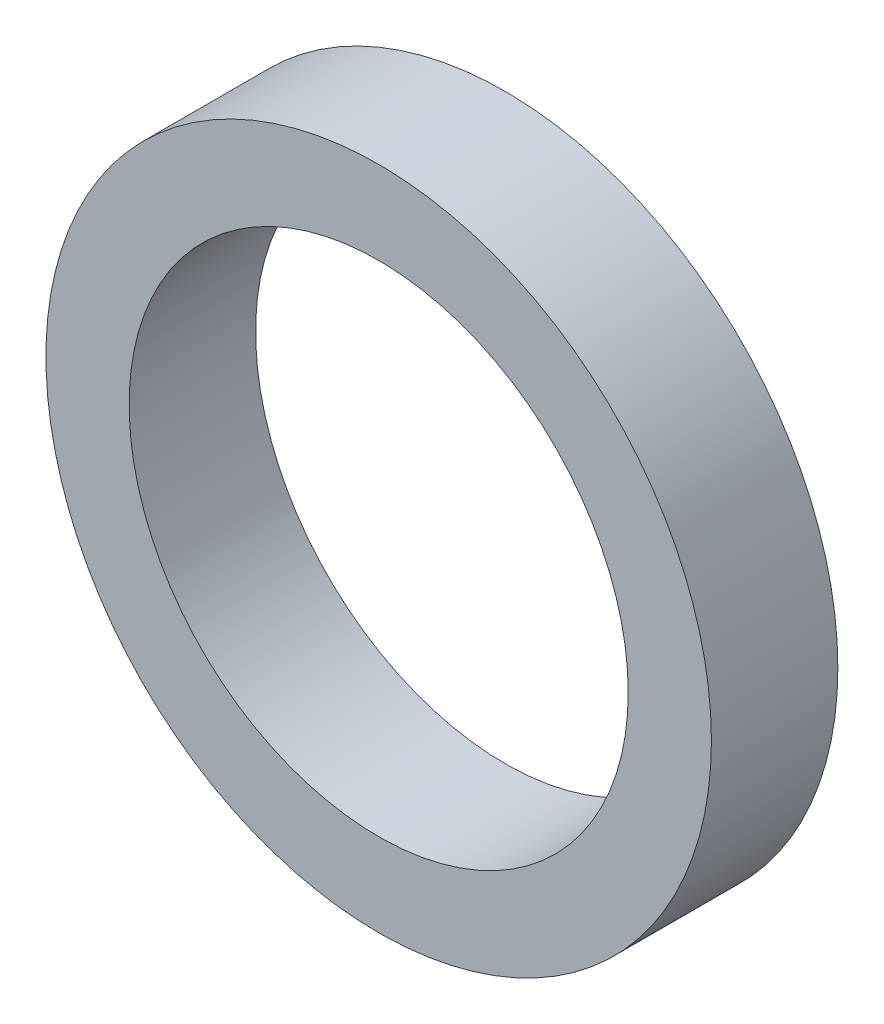
ISO-10303-21;
HEADER;
FILE_DESCRIPTION(('STEP AP214'),'2;1');
FILE_NAME('part.step','',(''),(''),'','','');
FILE_SCHEMA(('AUTOMOTIVE_DESIGN { 1 0 10303 214 1 1 1 1 }'));
ENDSEC;
DATA;
#1=APPLICATION_CONTEXT('core data for automotive mechanical design processes');
#2=APPLICATION_PROTOCOL_DEFINITION('international standard','automotive_design',2000,#1);
#3=PRODUCT_CONTEXT('',#1,'mechanical');
#4=PRODUCT('Part','Part','',(#3));
#5=PRODUCT_RELATED_PRODUCT_CATEGORY('part','',(#4));
#6=PRODUCT_DEFINITION_FORMATION('','',#4);
#7=PRODUCT_DEFINITION_CONTEXT('part definition',#1,'design');
#8=PRODUCT_DEFINITION('design','',#6,#7);
#9=PRODUCT_DEFINITION_SHAPE('','',#8);
#10=(LENGTH_UNIT() NAMED_UNIT(*) SI_UNIT(.MILLI.,.METRE.));
#11=(NAMED_UNIT(*) PLANE_ANGLE_UNIT() SI_UNIT($,.RADIAN.));
#12=(NAMED_UNIT(*) SI_UNIT($,.STERADIAN.) SOLID_ANGLE_UNIT());
#13=UNCERTAINTY_MEASURE_WITH_UNIT(LENGTH_MEASURE(1.E-05),#10,'distance_accuracy_value','');
#14=(GEOMETRIC_REPRESENTATION_CONTEXT(3) GLOBAL_UNCERTAINTY_ASSIGNED_CONTEXT((#13)) GLOBAL_UNIT_ASSIGNED_CONTEXT((#10,
#11,#12)) REPRESENTATION_CONTEXT('',''));
#15=CARTESIAN_POINT('',(0.,0.,0.));
#16=DIRECTION('',(0.,0.,1.));
#17=DIRECTION('',(1.,0.,0.));
#18=AXIS2_PLACEMENT_3D('',#15,#16,#17);
#19=CARTESIAN_POINT('',(0.,0.,19.));
#20=DIRECTION('',(0.,0.,1.));
#21=DIRECTION('',(1.,0.,0.));
#22=AXIS2_PLACEMENT_3D('',#19,#20,#21);
#23=PLANE('',#22);
#24=CARTESIAN_POINT('',(0.,0.,19.));
#25=DIRECTION('',(0.,0.,1.));
#26=DIRECTION('',(1.,0.,0.));
#27=AXIS2_PLACEMENT_3D('',#24,#25,#26);
#28=CIRCLE('',#27,50.);
#29=CARTESIAN_POINT('',(50.,0.,19.));
#30=VERTEX_POINT('',#29);
#31=EDGE_CURVE('E10',#30,#30,#28,.T.);
#32=ORIENTED_EDGE('',*,*,#31,.T.);
#33=EDGE_LOOP('',(#32));
#34=FACE_BOUND('',#33,.T.);
#35=CARTESIAN_POINT('',(0.,0.,19.));
#36=DIRECTION('',(0.,0.,1.));
#37=DIRECTION('',(1.,0.,0.));
#38=AXIS2_PLACEMENT_3D('',#35,#36,#37);
#39=CIRCLE('',#38,37.5);
#40=CARTESIAN_POINT('',(37.5,0.,19.));
#41=VERTEX_POINT('',#40);
#42=EDGE_CURVE('E49',#41,#41,#39,.T.);
#43=ORIENTED_EDGE('',*,*,#42,.F.);
#44=EDGE_LOOP('',(#43));
#45=FACE_BOUND('',#44,.T.);
#46=ADVANCED_FACE('F34',(#34,#45),#23,.T.);
#47=CARTESIAN_POINT('',(0.,0.,0.));
#48=DIRECTION('',(0.,0.,1.));
#49=DIRECTION('',(1.,0.,0.));
#50=AXIS2_PLACEMENT_3D('',#47,#48,#49);
#51=PLANE('',#50);
#52=CARTESIAN_POINT('',(0.,0.,0.));
#53=DIRECTION('',(0.,0.,1.));
#54=DIRECTION('',(1.,0.,0.));
#55=AXIS2_PLACEMENT_3D('',#52,#53,#54);
#56=CIRCLE('',#55,50.);
#57=CARTESIAN_POINT('',(50.,0.,0.));
#58=VERTEX_POINT('',#57);
#59=EDGE_CURVE('E38',#58,#58,#56,.T.);
#60=ORIENTED_EDGE('',*,*,#59,.F.);
#61=EDGE_LOOP('',(#60));
#62=FACE_BOUND('',#61,.T.);
#63=CARTESIAN_POINT('',(0.,0.,0.));
#64=DIRECTION('',(0.,0.,1.));
#65=DIRECTION('',(1.,0.,0.));
#66=AXIS2_PLACEMENT_3D('',#63,#64,#65);
#67=CIRCLE('',#66,37.5);
#68=CARTESIAN_POINT('',(37.5,0.,0.));
#69=VERTEX_POINT('',#68);
#70=EDGE_CURVE('E51',#69,#69,#67,.T.);
#71=ORIENTED_EDGE('',*,*,#70,.T.);
#72=EDGE_LOOP('',(#71));
#73=FACE_BOUND('',#72,.T.);
#74=ADVANCED_FACE('F65',(#62,#73),#51,.F.);
#75=CARTESIAN_POINT('',(0.,0.,19.));
#76=DIRECTION('',(0.,0.,-1.));
#77=DIRECTION('',(-1.,0.,0.));
#78=AXIS2_PLACEMENT_3D('',#75,#76,#77);
#79=CYLINDRICAL_SURFACE('',#78,50.);
#80=ORIENTED_EDGE('',*,*,#31,.F.);
#81=EDGE_LOOP('',(#80));
#82=FACE_BOUND('',#81,.T.);
#83=ORIENTED_EDGE('',*,*,#59,.T.);
#84=EDGE_LOOP('',(#83));
#85=FACE_BOUND('',#84,.T.);
#86=ADVANCED_FACE('F36',(#82,#85),#79,.T.);
#87=CARTESIAN_POINT('',(0.,0.,19.));
#88=DIRECTION('',(0.,0.,-1.));
#89=DIRECTION('',(-1.,0.,0.));
#90=AXIS2_PLACEMENT_3D('',#87,#88,#89);
#91=CYLINDRICAL_SURFACE('',#90,37.5);
#92=ORIENTED_EDGE('',*,*,#42,.T.);
#93=EDGE_LOOP('',(#92));
#94=FACE_BOUND('',#93,.T.);
#95=ORIENTED_EDGE('',*,*,#70,.F.);
#96=EDGE_LOOP('',(#95));
#97=FACE_BOUND('',#96,.T.);
#98=ADVANCED_FACE('F61',(#94,#97),#91,.F.);
#99=CLOSED_SHELL('',(#46,#74,#86,#98));
#100=MANIFOLD_SOLID_BREP('B2',#99);
#101=ADVANCED_BREP_SHAPE_REPRESENTATION('',(#18,#100),#14);
#102=SHAPE_DEFINITION_REPRESENTATION(#9,#101);
ENDSEC;
END-ISO-10303-21;
